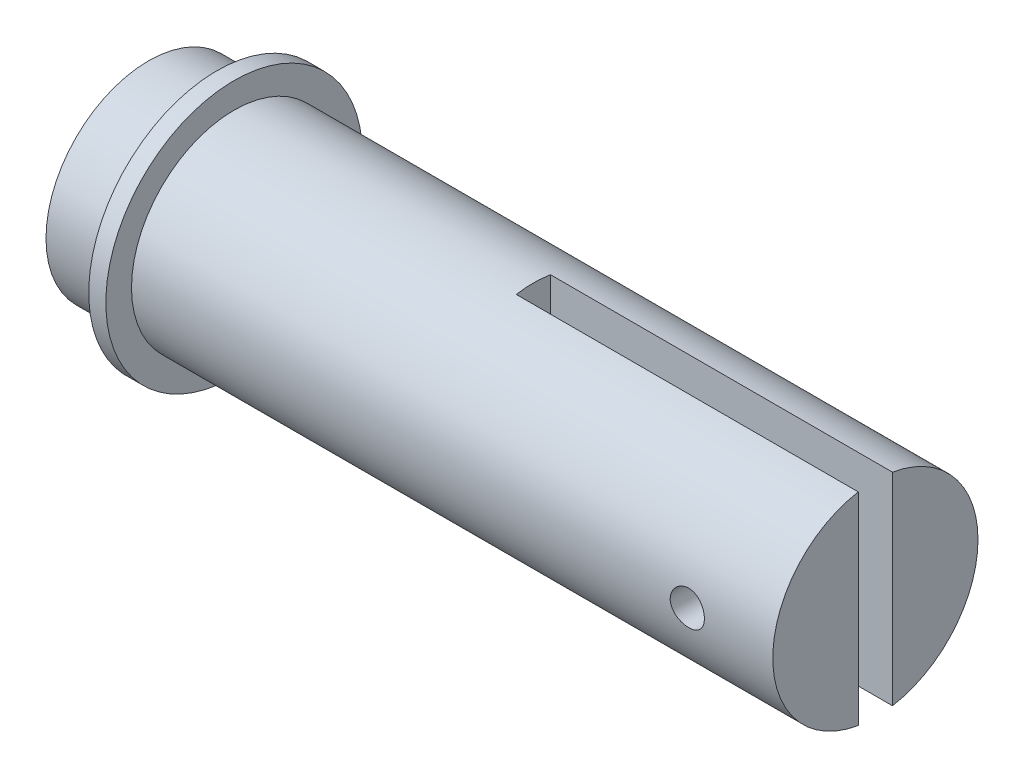
ISO-10303-21;
HEADER;
FILE_DESCRIPTION(('STEP AP214'),'2;1');
FILE_NAME('part.step','',(''),(''),'','','');
FILE_SCHEMA(('AUTOMOTIVE_DESIGN { 1 0 10303 214 1 1 1 1 }'));
ENDSEC;
DATA;
#1=APPLICATION_CONTEXT('core data for automotive mechanical design processes');
#2=APPLICATION_PROTOCOL_DEFINITION('international standard','automotive_design',2000,#1);
#3=PRODUCT_CONTEXT('',#1,'mechanical');
#4=PRODUCT('Part','Part','',(#3));
#5=PRODUCT_RELATED_PRODUCT_CATEGORY('part','',(#4));
#6=PRODUCT_DEFINITION_FORMATION('','',#4);
#7=PRODUCT_DEFINITION_CONTEXT('part definition',#1,'design');
#8=PRODUCT_DEFINITION('design','',#6,#7);
#9=PRODUCT_DEFINITION_SHAPE('','',#8);
#10=(LENGTH_UNIT() NAMED_UNIT(*) SI_UNIT(.MILLI.,.METRE.));
#11=(NAMED_UNIT(*) PLANE_ANGLE_UNIT() SI_UNIT($,.RADIAN.));
#12=(NAMED_UNIT(*) SI_UNIT($,.STERADIAN.) SOLID_ANGLE_UNIT());
#13=UNCERTAINTY_MEASURE_WITH_UNIT(LENGTH_MEASURE(1.E-05),#10,'distance_accuracy_value','');
#14=(GEOMETRIC_REPRESENTATION_CONTEXT(3) GLOBAL_UNCERTAINTY_ASSIGNED_CONTEXT((#13)) GLOBAL_UNIT_ASSIGNED_CONTEXT((#10,
#11,#12)) REPRESENTATION_CONTEXT('',''));
#15=CARTESIAN_POINT('',(0.,0.,0.));
#16=DIRECTION('',(0.,0.,1.));
#17=DIRECTION('',(1.,0.,0.));
#18=AXIS2_PLACEMENT_3D('',#15,#16,#17);
#19=CARTESIAN_POINT('',(-5.,0.,0.));
#20=DIRECTION('',(1.,0.,0.));
#21=DIRECTION('',(0.,0.,-1.));
#22=AXIS2_PLACEMENT_3D('',#19,#20,#21);
#23=CYLINDRICAL_SURFACE('',#22,12.);
#24=CARTESIAN_POINT('',(68.,0.,12.));
#25=CARTESIAN_POINT('',(68.0000044711582,0.111512723966572,11.9999980893506));
#26=CARTESIAN_POINT('',(68.0093578199751,0.223086305471056,11.9984294233043));
#27=CARTESIAN_POINT('',(68.0465085270123,0.443104177338433,11.9923227595311));
#28=CARTESIAN_POINT('',(68.0743228455293,0.551545494367395,11.9877820313911));
#29=CARTESIAN_POINT('',(68.1475323588742,0.762083797770111,11.9762405458916));
#30=CARTESIAN_POINT('',(68.1929131725125,0.864185894745516,11.9692418012735));
#31=CARTESIAN_POINT('',(68.2999298336419,1.05931347358235,11.9535538166566));
#32=CARTESIAN_POINT('',(68.3615638219864,1.15233999190287,11.9448647700355));
#33=CARTESIAN_POINT('',(68.4999640670564,1.32757809143334,11.9266665396665));
#34=CARTESIAN_POINT('',(68.5768552917089,1.40969032282797,11.9171509745189));
#35=CARTESIAN_POINT('',(68.7433183747783,1.55991079892794,11.8984210150139));
#36=CARTESIAN_POINT('',(68.8328910331653,1.62801815951277,11.8892066397013));
#37=CARTESIAN_POINT('',(69.0228567729577,1.7486937004841,11.8720605260782));
#38=CARTESIAN_POINT('',(69.1233130694438,1.8011636422888,11.8641370327331));
#39=CARTESIAN_POINT('',(69.3317676514405,1.88844669232897,11.8505583183574));
#40=CARTESIAN_POINT('',(69.4397654269421,1.92326099325249,11.8449029441145));
#41=CARTESIAN_POINT('',(69.6591842198852,1.97393150222784,11.836564294742));
#42=CARTESIAN_POINT('',(69.7705645892011,1.98995922330832,11.8338541478856));
#43=CARTESIAN_POINT('',(69.9944642215068,2.0031333802319,11.8316315114932));
#44=CARTESIAN_POINT('',(70.1069834033339,2.00028115231119,11.8321187956577));
#45=CARTESIAN_POINT('',(70.3287422890204,1.97591607871692,11.8362114309084));
#46=CARTESIAN_POINT('',(70.4380038428362,1.95459590551181,11.8397845865513));
#47=CARTESIAN_POINT('',(70.6513770542633,1.89420251232275,11.8495959616881));
#48=CARTESIAN_POINT('',(70.7554885351109,1.85512868345578,11.8558342725862));
#49=CARTESIAN_POINT('',(70.9561830587528,1.76014179687512,11.8703078346728));
#50=CARTESIAN_POINT('',(71.052727524865,1.70414873110376,11.8785525368586));
#51=CARTESIAN_POINT('',(71.2351235204307,1.57696961404594,11.8961033473201));
#52=CARTESIAN_POINT('',(71.3209741859639,1.50578233652342,11.9054095412343));
#53=CARTESIAN_POINT('',(71.4806608686459,1.34918576972724,11.9241762230383));
#54=CARTESIAN_POINT('',(71.5543348148321,1.2636111710985,11.9336371938532));
#55=CARTESIAN_POINT('',(71.6863022101323,1.08122819918531,11.9515408111738));
#56=CARTESIAN_POINT('',(71.7445955601466,0.984419753525136,11.959983451118));
#57=CARTESIAN_POINT('',(71.844161781709,0.78216473293337,11.9749111431433));
#58=CARTESIAN_POINT('',(71.885420335465,0.676710980451732,11.9813945472596));
#59=CARTESIAN_POINT('',(71.9495953721968,0.460238676482188,11.9916600241013));
#60=CARTESIAN_POINT('',(71.972513389579,0.349220591343575,11.9954423228038));
#61=CARTESIAN_POINT('',(71.9991370867689,0.126167921041297,11.9998490387415));
#62=CARTESIAN_POINT('',(72.0030652574445,0.0141605897208082,12.0005100241023));
#63=CARTESIAN_POINT('',(71.9921909244575,-0.208911818311909,11.9986997953694));
#64=CARTESIAN_POINT('',(71.977389141493,-0.31997693111363,11.9962287017929));
#65=CARTESIAN_POINT('',(71.9296601205316,-0.53732494043741,11.9884546155056));
#66=CARTESIAN_POINT('',(71.8968430332879,-0.643632694708303,11.9831688384105));
#67=CARTESIAN_POINT('',(71.8141323854404,-0.849237507888353,11.9703557156429));
#68=CARTESIAN_POINT('',(71.7642378658918,-0.948534172727772,11.9628282440962));
#69=CARTESIAN_POINT('',(71.6482791002426,-1.13826455157516,11.9462761304193));
#70=CARTESIAN_POINT('',(71.5820758750662,-1.22861220074972,11.9372388470962));
#71=CARTESIAN_POINT('',(71.435570147692,-1.39699486840215,11.9187077391352));
#72=CARTESIAN_POINT('',(71.3552666213787,-1.47502899175726,11.9092138813724));
#73=CARTESIAN_POINT('',(71.1818419615429,-1.61739422372639,11.8907214018868));
#74=CARTESIAN_POINT('',(71.0885966675885,-1.68157500889097,11.8817289290968));
#75=CARTESIAN_POINT('',(70.8925176246892,-1.79336184823598,11.8653722382231));
#76=CARTESIAN_POINT('',(70.789684179818,-1.84096842781585,11.8580079685282));
#77=CARTESIAN_POINT('',(70.5777682137503,-1.91803066517851,11.8457876295816));
#78=CARTESIAN_POINT('',(70.4687135239756,-1.94756114603835,11.8409212344885));
#79=CARTESIAN_POINT('',(70.2471038966226,-1.98786836302262,11.8342217346821));
#80=CARTESIAN_POINT('',(70.1345492642144,-1.99864672955693,11.8323883662618));
#81=CARTESIAN_POINT('',(69.9106358672301,-2.00109829283788,11.8319738646721));
#82=CARTESIAN_POINT('',(69.7992796971398,-1.99300810890014,11.8333524520452));
#83=CARTESIAN_POINT('',(69.5795366015594,-1.95846387116547,11.8391182516298));
#84=CARTESIAN_POINT('',(69.4711496664465,-1.93200987688998,11.8435054540897));
#85=CARTESIAN_POINT('',(69.2605132501659,-1.86157959167592,11.8547788502538));
#86=CARTESIAN_POINT('',(69.1582567919552,-1.81762367248035,11.8616621377574));
#87=CARTESIAN_POINT('',(68.9625314646441,-1.71346160313272,11.8771549513777));
#88=CARTESIAN_POINT('',(68.8690630317023,-1.65325464699884,11.8857645631072));
#89=CARTESIAN_POINT('',(68.6923715335138,-1.51745510749772,11.903867632365));
#90=CARTESIAN_POINT('',(68.6092831866398,-1.44168845087491,11.9133703646104));
#91=CARTESIAN_POINT('',(68.45691871642,-1.27728722510418,11.9321149788867));
#92=CARTESIAN_POINT('',(68.3876457850895,-1.1886496903301,11.9413568002124));
#93=CARTESIAN_POINT('',(68.2644413854401,-1.00029533571222,11.9586122371378));
#94=CARTESIAN_POINT('',(68.2106191685496,-0.900506230026246,11.9666169300248));
#95=CARTESIAN_POINT('',(68.1205844123121,-0.693210455503175,11.9804093408142));
#96=CARTESIAN_POINT('',(68.0843543351363,-0.585711595864,11.9861992654199));
#97=CARTESIAN_POINT('',(68.0383957806987,-0.398162648036314,11.9936463266636));
#98=CARTESIAN_POINT('',(68.0240204243072,-0.319247064238752,11.9960162181869));
#99=CARTESIAN_POINT('',(68.0048210097242,-0.160231448255843,11.999193727889));
#100=CARTESIAN_POINT('',(67.9999967870901,-0.0801314364867936,12.0000013729651));
#101=CARTESIAN_POINT('',(68.,0.,12.));
#102=B_SPLINE_CURVE_WITH_KNOTS('',3,(#24,#25,#26,#27,#28,#29,#30,#31,#32,#33,#34,#35,#36,#37,
#38,#39,#40,#41,#42,#43,#44,#45,#46,#47,#48,#49,#50,#51,#52,#53,#54,#55,#56,#57,#58,#59,#60,#61,
#62,#63,#64,#65,#66,#67,#68,#69,#70,#71,#72,#73,#74,#75,#76,#77,#78,#79,#80,#81,#82,#83,#84,#85,
#86,#87,#88,#89,#90,#91,#92,#93,#94,#95,#96,#97,#98,#99,#100,#101),.UNSPECIFIED.,.T.,.F.,(4,2,2,
2,2,2,2,2,2,2,2,2,2,2,2,2,2,2,2,2,2,2,2,2,2,2,2,2,2,2,2,2,2,2,2,2,2,2,4),(0.,0.334245267950807,
0.668798036556335,1.00307749362021,1.33731873013983,1.67441992849866,2.01154240135885,
2.35074016659072,2.68991501500944,3.02596861682738,3.36199843456709,3.69456417408328,
4.02714132020306,4.36131645306046,4.69551856544459,5.03386215929061,5.37220793308677,
5.71083751132721,6.04943875616918,6.38406306793116,6.71867450428686,7.05126245605131,
7.38386908660852,7.71941460501617,8.05498450443425,8.39403057606093,8.73306589900751,
9.07068817873414,9.40828110229293,9.74166327618159,10.075044369505,10.4080385458098,
10.7410492402347,11.0780110735471,11.4150506710318,11.7544178528576,12.0934460170406,
12.3336339853121,12.5738178182157),.UNSPECIFIED.);
#103=CARTESIAN_POINT('',(68.,0.,12.));
#104=VERTEX_POINT('',#103);
#105=EDGE_CURVE('E178',#104,#104,#102,.T.);
#106=ORIENTED_EDGE('',*,*,#105,.T.);
#107=EDGE_LOOP('',(#106));
#108=FACE_BOUND('',#107,.T.);
#109=CARTESIAN_POINT('',(5.,0.,0.));
#110=DIRECTION('',(1.,0.,0.));
#111=DIRECTION('',(0.,0.,-1.));
#112=AXIS2_PLACEMENT_3D('',#109,#110,#111);
#113=CIRCLE('',#112,12.);
#114=CARTESIAN_POINT('',(5.,0.,-12.));
#115=VERTEX_POINT('',#114);
#116=EDGE_CURVE('E13',#115,#115,#113,.F.);
#117=ORIENTED_EDGE('',*,*,#116,.F.);
#118=EDGE_LOOP('',(#117));
#119=FACE_BOUND('',#118,.T.);
#120=CARTESIAN_POINT('',(80.,0.,0.));
#121=DIRECTION('',(1.,0.,0.));
#122=DIRECTION('',(0.,0.,-1.));
#123=AXIS2_PLACEMENT_3D('',#120,#121,#122);
#124=CIRCLE('',#123,12.);
#125=CARTESIAN_POINT('',(80.,-11.8321595661992,-2.));
#126=VERTEX_POINT('',#125);
#127=CARTESIAN_POINT('',(80.,11.8321595661992,-2.));
#128=VERTEX_POINT('',#127);
#129=EDGE_CURVE('E134',#126,#128,#124,.T.);
#130=ORIENTED_EDGE('',*,*,#129,.F.);
#131=DIRECTION('',(1.,0.,0.));
#132=VECTOR('',#131,1.);
#133=CARTESIAN_POINT('',(40.,-11.8321595661992,-2.));
#134=LINE('',#133,#132);
#135=CARTESIAN_POINT('',(40.,-11.8321595661992,-2.));
#136=VERTEX_POINT('',#135);
#137=EDGE_CURVE('E91',#136,#126,#134,.T.);
#138=ORIENTED_EDGE('',*,*,#137,.F.);
#139=CARTESIAN_POINT('',(40.,0.,0.));
#140=DIRECTION('',(1.,0.,0.));
#141=DIRECTION('',(0.,0.,-1.));
#142=AXIS2_PLACEMENT_3D('',#139,#140,#141);
#143=CIRCLE('',#142,12.);
#144=CARTESIAN_POINT('',(40.,-11.8321595661992,2.));
#145=VERTEX_POINT('',#144);
#146=EDGE_CURVE('E104',#145,#136,#143,.T.);
#147=ORIENTED_EDGE('',*,*,#146,.F.);
#148=DIRECTION('',(1.,0.,0.));
#149=VECTOR('',#148,1.);
#150=CARTESIAN_POINT('',(40.,-11.8321595661992,2.));
#151=LINE('',#150,#149);
#152=CARTESIAN_POINT('',(80.,-11.8321595661992,2.));
#153=VERTEX_POINT('',#152);
#154=EDGE_CURVE('E102',#145,#153,#151,.T.);
#155=ORIENTED_EDGE('',*,*,#154,.T.);
#156=CARTESIAN_POINT('',(80.,11.8321595661992,2.));
#157=VERTEX_POINT('',#156);
#158=EDGE_CURVE('E116',#157,#153,#124,.T.);
#159=ORIENTED_EDGE('',*,*,#158,.F.);
#160=DIRECTION('',(1.,0.,0.));
#161=VECTOR('',#160,1.);
#162=CARTESIAN_POINT('',(40.,11.8321595661992,2.));
#163=LINE('',#162,#161);
#164=CARTESIAN_POINT('',(40.,11.8321595661992,2.));
#165=VERTEX_POINT('',#164);
#166=EDGE_CURVE('E99',#165,#157,#163,.T.);
#167=ORIENTED_EDGE('',*,*,#166,.F.);
#168=CARTESIAN_POINT('',(40.,11.8321595661992,-2.));
#169=VERTEX_POINT('',#168);
#170=EDGE_CURVE('E105',#169,#165,#143,.T.);
#171=ORIENTED_EDGE('',*,*,#170,.F.);
#172=DIRECTION('',(1.,0.,0.));
#173=VECTOR('',#172,1.);
#174=CARTESIAN_POINT('',(40.,11.8321595661992,-2.));
#175=LINE('',#174,#173);
#176=EDGE_CURVE('E117',#169,#128,#175,.T.);
#177=ORIENTED_EDGE('',*,*,#176,.T.);
#178=EDGE_LOOP('',(#130,#138,#147,#155,#159,#167,#171,#177));
#179=FACE_BOUND('',#178,.T.);
#180=CARTESIAN_POINT('',(68.,0.,-12.));
#181=CARTESIAN_POINT('',(68.0000044711582,-0.111512723966572,-11.9999980893506));
#182=CARTESIAN_POINT('',(68.0093578199751,-0.223086305471056,-11.9984294233043));
#183=CARTESIAN_POINT('',(68.0465085270123,-0.443104177338433,-11.9923227595311));
#184=CARTESIAN_POINT('',(68.0743228455293,-0.551545494367395,-11.9877820313911));
#185=CARTESIAN_POINT('',(68.1475323588742,-0.762083797770111,-11.9762405458916));
#186=CARTESIAN_POINT('',(68.1929131725125,-0.864185894745516,-11.9692418012735));
#187=CARTESIAN_POINT('',(68.2999298336419,-1.05931347358235,-11.9535538166566));
#188=CARTESIAN_POINT('',(68.3615638219864,-1.15233999190287,-11.9448647700355));
#189=CARTESIAN_POINT('',(68.4999640670564,-1.32757809143334,-11.9266665396665));
#190=CARTESIAN_POINT('',(68.5768552917089,-1.40969032282797,-11.9171509745189));
#191=CARTESIAN_POINT('',(68.7433183747783,-1.55991079892794,-11.8984210150139));
#192=CARTESIAN_POINT('',(68.8328910331653,-1.62801815951277,-11.8892066397013));
#193=CARTESIAN_POINT('',(69.0228567729577,-1.7486937004841,-11.8720605260782));
#194=CARTESIAN_POINT('',(69.1233130694438,-1.8011636422888,-11.8641370327331));
#195=CARTESIAN_POINT('',(69.3317676514405,-1.88844669232897,-11.8505583183574));
#196=CARTESIAN_POINT('',(69.4397654269421,-1.92326099325249,-11.8449029441145));
#197=CARTESIAN_POINT('',(69.6591842198852,-1.97393150222784,-11.836564294742));
#198=CARTESIAN_POINT('',(69.7705645892011,-1.98995922330832,-11.8338541478856));
#199=CARTESIAN_POINT('',(69.9944642215068,-2.0031333802319,-11.8316315114932));
#200=CARTESIAN_POINT('',(70.1069834033339,-2.00028115231119,-11.8321187956577));
#201=CARTESIAN_POINT('',(70.3287422890204,-1.97591607871692,-11.8362114309084));
#202=CARTESIAN_POINT('',(70.4380038428362,-1.95459590551181,-11.8397845865513));
#203=CARTESIAN_POINT('',(70.6513770542633,-1.89420251232275,-11.8495959616881));
#204=CARTESIAN_POINT('',(70.7554885351109,-1.85512868345578,-11.8558342725862));
#205=CARTESIAN_POINT('',(70.9561830587528,-1.76014179687512,-11.8703078346728));
#206=CARTESIAN_POINT('',(71.052727524865,-1.70414873110376,-11.8785525368586));
#207=CARTESIAN_POINT('',(71.2351235204307,-1.57696961404594,-11.8961033473201));
#208=CARTESIAN_POINT('',(71.3209741859639,-1.50578233652342,-11.9054095412343));
#209=CARTESIAN_POINT('',(71.4806608686459,-1.34918576972724,-11.9241762230383));
#210=CARTESIAN_POINT('',(71.5543348148321,-1.2636111710985,-11.9336371938532));
#211=CARTESIAN_POINT('',(71.6863022101323,-1.08122819918531,-11.9515408111738));
#212=CARTESIAN_POINT('',(71.7445955601466,-0.984419753525136,-11.959983451118));
#213=CARTESIAN_POINT('',(71.844161781709,-0.78216473293337,-11.9749111431433));
#214=CARTESIAN_POINT('',(71.885420335465,-0.676710980451732,-11.9813945472596));
#215=CARTESIAN_POINT('',(71.9495953721968,-0.460238676482188,-11.9916600241013));
#216=CARTESIAN_POINT('',(71.972513389579,-0.349220591343575,-11.9954423228038));
#217=CARTESIAN_POINT('',(71.9991370867689,-0.126167921041297,-11.9998490387415));
#218=CARTESIAN_POINT('',(72.0030652574445,-0.0141605897208082,-12.0005100241023));
#219=CARTESIAN_POINT('',(71.9921909244575,0.208911818311909,-11.9986997953694));
#220=CARTESIAN_POINT('',(71.977389141493,0.31997693111363,-11.9962287017929));
#221=CARTESIAN_POINT('',(71.9296601205316,0.53732494043741,-11.9884546155056));
#222=CARTESIAN_POINT('',(71.8968430332879,0.643632694708303,-11.9831688384105));
#223=CARTESIAN_POINT('',(71.8141323854404,0.849237507888353,-11.9703557156429));
#224=CARTESIAN_POINT('',(71.7642378658918,0.948534172727772,-11.9628282440962));
#225=CARTESIAN_POINT('',(71.6482791002426,1.13826455157516,-11.9462761304193));
#226=CARTESIAN_POINT('',(71.5820758750662,1.22861220074972,-11.9372388470962));
#227=CARTESIAN_POINT('',(71.435570147692,1.39699486840215,-11.9187077391352));
#228=CARTESIAN_POINT('',(71.3552666213787,1.47502899175726,-11.9092138813724));
#229=CARTESIAN_POINT('',(71.1818419615429,1.61739422372639,-11.8907214018868));
#230=CARTESIAN_POINT('',(71.0885966675885,1.68157500889097,-11.8817289290968));
#231=CARTESIAN_POINT('',(70.8925176246892,1.79336184823598,-11.8653722382231));
#232=CARTESIAN_POINT('',(70.789684179818,1.84096842781585,-11.8580079685282));
#233=CARTESIAN_POINT('',(70.5777682137503,1.91803066517851,-11.8457876295816));
#234=CARTESIAN_POINT('',(70.4687135239756,1.94756114603835,-11.8409212344885));
#235=CARTESIAN_POINT('',(70.2471038966226,1.98786836302262,-11.8342217346821));
#236=CARTESIAN_POINT('',(70.1345492642144,1.99864672955693,-11.8323883662618));
#237=CARTESIAN_POINT('',(69.9106358672301,2.00109829283788,-11.8319738646721));
#238=CARTESIAN_POINT('',(69.7992796971398,1.99300810890014,-11.8333524520452));
#239=CARTESIAN_POINT('',(69.5795366015594,1.95846387116547,-11.8391182516298));
#240=CARTESIAN_POINT('',(69.4711496664465,1.93200987688998,-11.8435054540897));
#241=CARTESIAN_POINT('',(69.2605132501659,1.86157959167592,-11.8547788502538));
#242=CARTESIAN_POINT('',(69.1582567919552,1.81762367248035,-11.8616621377574));
#243=CARTESIAN_POINT('',(68.9625314646441,1.71346160313272,-11.8771549513777));
#244=CARTESIAN_POINT('',(68.8690630317023,1.65325464699884,-11.8857645631072));
#245=CARTESIAN_POINT('',(68.6923715335138,1.51745510749772,-11.903867632365));
#246=CARTESIAN_POINT('',(68.6092831866398,1.44168845087491,-11.9133703646104));
#247=CARTESIAN_POINT('',(68.45691871642,1.27728722510418,-11.9321149788867));
#248=CARTESIAN_POINT('',(68.3876457850895,1.1886496903301,-11.9413568002124));
#249=CARTESIAN_POINT('',(68.2644413854401,1.00029533571222,-11.9586122371378));
#250=CARTESIAN_POINT('',(68.2106191685496,0.900506230026246,-11.9666169300248));
#251=CARTESIAN_POINT('',(68.1205844123121,0.693210455503175,-11.9804093408142));
#252=CARTESIAN_POINT('',(68.0843543351363,0.585711595864,-11.9861992654199));
#253=CARTESIAN_POINT('',(68.0383957806987,0.398162648036314,-11.9936463266636));
#254=CARTESIAN_POINT('',(68.0240204243072,0.319247064238752,-11.9960162181869));
#255=CARTESIAN_POINT('',(68.0048210097242,0.160231448255843,-11.999193727889));
#256=CARTESIAN_POINT('',(67.9999967870901,0.0801314364867936,-12.0000013729651));
#257=CARTESIAN_POINT('',(68.,0.,-12.));
#258=B_SPLINE_CURVE_WITH_KNOTS('',3,(#180,#181,#182,#183,#184,#185,#186,#187,#188,#189,#190,
#191,#192,#193,#194,#195,#196,#197,#198,#199,#200,#201,#202,#203,#204,#205,#206,#207,#208,#209,
#210,#211,#212,#213,#214,#215,#216,#217,#218,#219,#220,#221,#222,#223,#224,#225,#226,#227,#228,
#229,#230,#231,#232,#233,#234,#235,#236,#237,#238,#239,#240,#241,#242,#243,#244,#245,#246,#247,
#248,#249,#250,#251,#252,#253,#254,#255,#256,#257),.UNSPECIFIED.,.T.,.F.,(4,2,2,2,2,2,2,2,2,2,2,
2,2,2,2,2,2,2,2,2,2,2,2,2,2,2,2,2,2,2,2,2,2,2,2,2,2,2,4),(0.,0.334245267950807,
0.668798036556335,1.00307749362021,1.33731873013983,1.67441992849866,2.01154240135885,
2.35074016659072,2.68991501500944,3.02596861682738,3.36199843456709,3.69456417408328,
4.02714132020306,4.36131645306046,4.69551856544459,5.03386215929061,5.37220793308677,
5.71083751132721,6.04943875616918,6.38406306793116,6.71867450428686,7.05126245605131,
7.38386908660852,7.71941460501617,8.05498450443425,8.39403057606093,8.73306589900751,
9.07068817873414,9.40828110229293,9.74166327618159,10.075044369505,10.4080385458098,
10.7410492402347,11.0780110735471,11.4150506710318,11.7544178528576,12.0934460170406,
12.3336339853121,12.5738178182157),.UNSPECIFIED.);
#259=CARTESIAN_POINT('',(68.,0.,-12.));
#260=VERTEX_POINT('',#259);
#261=EDGE_CURVE('E220',#260,#260,#258,.T.);
#262=ORIENTED_EDGE('',*,*,#261,.T.);
#263=EDGE_LOOP('',(#262));
#264=FACE_BOUND('',#263,.T.);
#265=ADVANCED_FACE('F48',(#108,#119,#179,#264),#23,.T.);
#266=CARTESIAN_POINT('',(80.,0.,0.));
#267=DIRECTION('',(1.,0.,0.));
#268=DIRECTION('',(0.,0.,-1.));
#269=AXIS2_PLACEMENT_3D('',#266,#267,#268);
#270=PLANE('',#269);
#271=ORIENTED_EDGE('',*,*,#129,.T.);
#272=DIRECTION('',(0.,-1.,0.));
#273=VECTOR('',#272,1.);
#274=CARTESIAN_POINT('',(80.,0.,-2.));
#275=LINE('',#274,#273);
#276=EDGE_CURVE('E226',#128,#126,#275,.T.);
#277=ORIENTED_EDGE('',*,*,#276,.T.);
#278=EDGE_LOOP('',(#271,#277));
#279=FACE_BOUND('',#278,.T.);
#280=ADVANCED_FACE('F159',(#279),#270,.T.);
#281=CARTESIAN_POINT('',(0.,-11.8321595661992,2.));
#282=CARTESIAN_POINT('',(-0.111500598529449,-11.8321615789328,1.99999551873586));
#283=CARTESIAN_POINT('',(-0.223062084857178,-11.8337527390819,1.99064413522262));
#284=CARTESIAN_POINT('',(-0.443054834610535,-11.8399396576003,1.9535019424531));
#285=CARTESIAN_POINT('',(-0.551483115006452,-11.844538186771,1.92569412824689));
#286=CARTESIAN_POINT('',(-0.761993826673285,-11.8562048749385,1.8525036349364));
#287=CARTESIAN_POINT('',(-0.864081478929797,-11.8632709694721,1.80713564394559));
#288=CARTESIAN_POINT('',(-1.05918476377422,-11.8790741768183,1.70014919751157));
#289=CARTESIAN_POINT('',(-1.15220141566187,-11.8878111015538,1.63853257080106));
#290=CARTESIAN_POINT('',(-1.32745027979565,-11.906067769247,1.50015002157323));
#291=CARTESIAN_POINT('',(-1.40958010510897,-11.9155937386236,1.42325523914587));
#292=CARTESIAN_POINT('',(-1.55983464548945,-11.9342998453486,1.25677760375622));
#293=CARTESIAN_POINT('',(-1.62795853049233,-11.9434799621739,1.16719399931998));
#294=CARTESIAN_POINT('',(-1.74865165377542,-11.9605258958617,0.977218295958684));
#295=CARTESIAN_POINT('',(-1.80112560618544,-11.9683835394587,0.876764865165367));
#296=CARTESIAN_POINT('',(-1.88841685642444,-11.9818298956567,0.668316497379094));
#297=CARTESIAN_POINT('',(-1.9232353023079,-11.9874187557813,0.56032205126255));
#298=CARTESIAN_POINT('',(-1.97391402798712,-11.9956538777952,0.340914981075394));
#299=CARTESIAN_POINT('',(-1.98994633280375,-11.9983268248873,0.229543109343417));
#300=CARTESIAN_POINT('',(-2.00313260332208,-12.0005206347422,0.00566022842063782));
#301=CARTESIAN_POINT('',(-2.00028785219779,-12.0000417117545,-0.106850702823119));
#302=CARTESIAN_POINT('',(-1.97593491877743,-11.9960068674511,-0.328641748063101));
#303=CARTESIAN_POINT('',(-1.95461186927268,-11.9924814695392,-0.437942824560113));
#304=CARTESIAN_POINT('',(-1.89419914060281,-11.9827838301731,-0.651393583689433));
#305=CARTESIAN_POINT('',(-1.8551089203284,-11.9766115081057,-0.755543109321203));
#306=CARTESIAN_POINT('',(-1.76008748774774,-11.9622615880957,-0.956284918226118));
#307=CARTESIAN_POINT('',(-1.70407999033405,-11.954074938615,-1.05284041841524));
#308=CARTESIAN_POINT('',(-1.57686974189196,-11.936605904572,-1.23525242387731));
#309=CARTESIAN_POINT('',(-1.50566576103135,-11.9273234313531,-1.3211080623327));
#310=CARTESIAN_POINT('',(-1.34905695470455,-11.9085621458608,-1.48077701875733));
#311=CARTESIAN_POINT('',(-1.26349032407921,-11.8990823178483,-1.55443160180257));
#312=CARTESIAN_POINT('',(-1.08113032782734,-11.8811036782784,-1.68636367075845));
#313=CARTESIAN_POINT('',(-0.984336858653744,-11.8726048757706,-1.74464101482593));
#314=CARTESIAN_POINT('',(-0.782086686498017,-11.8575500364945,-1.84419554759063));
#315=CARTESIAN_POINT('',(-0.676620401526328,-11.8509961864208,-1.88545362182339));
#316=CARTESIAN_POINT('',(-0.460120742153965,-11.840609509519,-1.94962389665249));
#317=CARTESIAN_POINT('',(-0.349087858854061,-11.8367764431066,-1.97253771261436));
#318=CARTESIAN_POINT('',(-0.126027075070295,-11.8323116753769,-1.99914550790341));
#319=CARTESIAN_POINT('',(-0.0140268962383187,-11.8316422860694,-2.00306576632995));
#320=CARTESIAN_POINT('',(0.209029337352656,-11.8334802782589,-1.99217816214597));
#321=CARTESIAN_POINT('',(0.320085428411178,-11.8359875370548,-1.97737102289973));
#322=CARTESIAN_POINT('',(0.537382207352686,-11.8438614996401,-1.92964186794248));
#323=CARTESIAN_POINT('',(0.643648911902408,-11.8492100153468,-1.89683503251711));
#324=CARTESIAN_POINT('',(0.849176133023589,-11.862148584044,-1.81415855215382));
#325=CARTESIAN_POINT('',(0.948436230040721,-11.8697387711246,-1.76428788648075));
#326=CARTESIAN_POINT('',(1.13813967552489,-11.8863930271791,-1.64836533858338));
#327=CARTESIAN_POINT('',(1.22849325820485,-11.8954700448028,-1.58216845132749));
#328=CARTESIAN_POINT('',(1.396890826156,-11.9140373334389,-1.43567157256639));
#329=CARTESIAN_POINT('',(1.47493394488779,-11.9235276334827,-1.35537058910724));
#330=CARTESIAN_POINT('',(1.61732151418296,-11.9419713769461,-1.18194245626305));
#331=CARTESIAN_POINT('',(1.68151506102763,-11.9509182107574,-1.08869060270896));
#332=CARTESIAN_POINT('',(1.7933242616039,-11.9671608994635,-0.892594758359461));
#333=CARTESIAN_POINT('',(1.84094045157908,-11.9744568077598,-0.789751077976501));
#334=CARTESIAN_POINT('',(1.91800846716389,-11.9865468653567,-0.577839241201063));
#335=CARTESIAN_POINT('',(1.94753926058794,-11.9913518765409,-0.468800450082089));
#336=CARTESIAN_POINT('',(1.98785247917106,-11.9979646653543,-0.247224587899369));
#337=CARTESIAN_POINT('',(1.99863644698588,-11.9997726896015,-0.134687805457296));
#338=CARTESIAN_POINT('',(2.00110550584976,-12.0001843031025,0.0892330206189409));
#339=CARTESIAN_POINT('',(1.99302020315287,-11.9988264161935,0.200614528482131));
#340=CARTESIAN_POINT('',(1.95847686218446,-11.9931374270987,0.420409579451763));
#341=CARTESIAN_POINT('',(1.93201892679226,-11.9888063415615,0.528823139173983));
#342=CARTESIAN_POINT('',(1.86156946756508,-11.9776559106192,0.73951715673483));
#343=CARTESIAN_POINT('',(1.81759746543196,-11.970839336327,0.841804297723056));
#344=CARTESIAN_POINT('',(1.71339365101553,-11.9554620550242,1.03758436238573));
#345=CARTESIAN_POINT('',(1.65316106795004,-11.9469012653393,1.13107686889458));
#346=CARTESIAN_POINT('',(1.5173319260316,-11.9288610369313,1.30777035642112));
#347=CARTESIAN_POINT('',(1.441567236199,-11.919372196329,1.3908411444822));
#348=CARTESIAN_POINT('',(1.27717735367695,-11.900610426515,1.54317110076073));
#349=CARTESIAN_POINT('',(1.18854915286998,-11.8913375483961,1.61242702936952));
#350=CARTESIAN_POINT('',(1.00020374200831,-11.8739867482713,1.73561141672869));
#351=CARTESIAN_POINT('',(0.900412528187612,-11.8659177427663,1.78942799124616));
#352=CARTESIAN_POINT('',(0.693112611329484,-11.8519936807305,1.87945162912342));
#353=CARTESIAN_POINT('',(0.585611741858109,-11.846136413799,1.91567628417846));
#354=CARTESIAN_POINT('',(0.398076984410093,-11.8385979588519,1.96162084250194));
#355=CARTESIAN_POINT('',(0.319178553629914,-11.8361969873557,1.97598993413711));
#356=CARTESIAN_POINT('',(0.16019721213045,-11.8329770823046,1.99518103614505));
#357=CARTESIAN_POINT('',(0.0801143229406407,-11.8321581200295,2.00000321983422));
#358=CARTESIAN_POINT('',(0.,-11.8321595661992,2.));
#359=B_SPLINE_CURVE_WITH_KNOTS('',3,(#281,#282,#283,#284,#285,#286,#287,#288,#289,#290,#291,
#292,#293,#294,#295,#296,#297,#298,#299,#300,#301,#302,#303,#304,#305,#306,#307,#308,#309,#310,
#311,#312,#313,#314,#315,#316,#317,#318,#319,#320,#321,#322,#323,#324,#325,#326,#327,#328,#329,
#330,#331,#332,#333,#334,#335,#336,#337,#338,#339,#340,#341,#342,#343,#344,#345,#346,#347,#348,
#349,#350,#351,#352,#353,#354,#355,#356,#357,#358),.UNSPECIFIED.,.T.,.F.,(4,2,2,2,2,2,2,2,2,2,2,
2,2,2,2,2,2,2,2,2,2,2,2,2,2,2,2,2,2,2,2,2,2,2,2,2,2,2,4),(0.,0.334208831142192,
0.668726015970376,1.00296399830015,1.33716437924219,1.67431327324572,2.01148214267558,
2.35066384089148,2.6898234808889,3.02585253978052,3.36185875722154,3.69453696931735,
4.02722531399626,4.3614368331154,4.69567540981411,5.03396898769699,5.37226568596815,
5.71094129998883,6.04958708750462,6.38418833936328,6.71877666731181,7.05124851708393,
7.3837402583486,7.71929874210162,8.05488083544551,8.39395290428305,8.73301400381358,
9.07058387534117,9.40812596729881,9.74158221012733,10.0750365857506,10.4081203186597,
10.7412198431387,11.078135979706,11.4151310310545,11.7545098209466,12.0935485339556,
12.3336853643501,12.5738178352145),.UNSPECIFIED.);
#360=CARTESIAN_POINT('',(0.,-11.8321595661992,2.));
#361=VERTEX_POINT('',#360);
#362=EDGE_CURVE('E133',#361,#361,#359,.T.);
#363=ORIENTED_EDGE('',*,*,#362,.F.);
#364=EDGE_LOOP('',(#363));
#365=FACE_BOUND('',#364,.T.);
#366=CARTESIAN_POINT('',(-5.,0.,0.));
#367=DIRECTION('',(1.,0.,0.));
#368=DIRECTION('',(0.,0.,-1.));
#369=AXIS2_PLACEMENT_3D('',#366,#367,#368);
#370=CIRCLE('',#369,12.);
#371=CARTESIAN_POINT('',(-5.,0.,-12.));
#372=VERTEX_POINT('',#371);
#373=EDGE_CURVE('E62',#372,#372,#370,.T.);
#374=ORIENTED_EDGE('',*,*,#373,.T.);
#375=EDGE_LOOP('',(#374));
#376=FACE_BOUND('',#375,.T.);
#377=CARTESIAN_POINT('',(3.,0.,0.));
#378=DIRECTION('',(1.,0.,0.));
#379=DIRECTION('',(0.,0.,-1.));
#380=AXIS2_PLACEMENT_3D('',#377,#378,#379);
#381=CIRCLE('',#380,12.);
#382=CARTESIAN_POINT('',(3.,0.,-12.));
#383=VERTEX_POINT('',#382);
#384=EDGE_CURVE('E126',#383,#383,#381,.F.);
#385=ORIENTED_EDGE('',*,*,#384,.T.);
#386=EDGE_LOOP('',(#385));
#387=FACE_BOUND('',#386,.T.);
#388=ADVANCED_FACE('F161',(#365,#376,#387),#23,.T.);
#389=CARTESIAN_POINT('',(-5.,0.,0.));
#390=DIRECTION('',(1.,0.,0.));
#391=DIRECTION('',(0.,0.,-1.));
#392=AXIS2_PLACEMENT_3D('',#389,#390,#391);
#393=PLANE('',#392);
#394=CARTESIAN_POINT('',(-5.,-8.,0.));
#395=DIRECTION('',(1.,0.,0.));
#396=DIRECTION('',(0.,0.,-1.));
#397=AXIS2_PLACEMENT_3D('',#394,#395,#396);
#398=CIRCLE('',#397,1.);
#399=CARTESIAN_POINT('',(-5.,-8.,-1.));
#400=VERTEX_POINT('',#399);
#401=EDGE_CURVE('E237',#400,#400,#398,.T.);
#402=ORIENTED_EDGE('',*,*,#401,.T.);
#403=EDGE_LOOP('',(#402));
#404=FACE_BOUND('',#403,.T.);
#405=ORIENTED_EDGE('',*,*,#373,.F.);
#406=EDGE_LOOP('',(#405));
#407=FACE_BOUND('',#406,.T.);
#408=ADVANCED_FACE('F150',(#404,#407),#393,.F.);
#409=CARTESIAN_POINT('',(0.,-80.,0.));
#410=DIRECTION('',(0.,1.,0.));
#411=DIRECTION('',(0.,0.,1.));
#412=AXIS2_PLACEMENT_3D('',#409,#410,#411);
#413=CYLINDRICAL_SURFACE('',#412,2.);
#414=CARTESIAN_POINT('',(-1.73205080756888,-8.,-1.));
#415=CARTESIAN_POINT('',(-1.73205534728459,-8.05210780819525,-0.999996363074532));
#416=CARTESIAN_POINT('',(-1.73443801187756,-8.10428141152505,-0.995899970733217));
#417=CARTESIAN_POINT('',(-1.74362366452052,-8.20702726467715,-0.979723209898053));
#418=CARTESIAN_POINT('',(-1.75043594055559,-8.25759591504341,-0.967626064554179));
#419=CARTESIAN_POINT('',(-1.76749346605398,-8.35545166434394,-0.936099948699812));
#420=CARTESIAN_POINT('',(-1.77772043473252,-8.40275465247359,-0.916709952493731));
#421=CARTESIAN_POINT('',(-1.80042664816858,-8.49342420199672,-0.871267525376372));
#422=CARTESIAN_POINT('',(-1.81290601476065,-8.53679055026246,-0.845214734035774));
#423=CARTESIAN_POINT('',(-1.83996869057441,-8.62230572855751,-0.784666540530879));
#424=CARTESIAN_POINT('',(-1.85464063637954,-8.66405913567354,-0.749652036143771));
#425=CARTESIAN_POINT('',(-1.88371982785706,-8.74140838840671,-0.673253807614469));
#426=CARTESIAN_POINT('',(-1.8981269383125,-8.77700116258352,-0.631866925782293));
#427=CARTESIAN_POINT('',(-1.92621476952949,-8.84336715114766,-0.540489563414546));
#428=CARTESIAN_POINT('',(-1.93978106418172,-8.87365376785953,-0.490107189012575));
#429=CARTESIAN_POINT('',(-1.96350756099529,-8.92514085324576,-0.384157026599505));
#430=CARTESIAN_POINT('',(-1.97366991183742,-8.94634705613717,-0.328592538138156));
#431=CARTESIAN_POINT('',(-1.98880461244237,-8.9775046613011,-0.218044943925978));
#432=CARTESIAN_POINT('',(-1.99409480220892,-8.98814952635553,-0.163301790488818));
#433=CARTESIAN_POINT('',(-2.00007583846067,-9.00016611867504,-0.0525706286978488));
#434=CARTESIAN_POINT('',(-2.0007694678459,-9.00154345679571,0.00341660584373811));
#435=CARTESIAN_POINT('',(-1.9976298191645,-8.99525332602965,0.10983252442375));
#436=CARTESIAN_POINT('',(-1.9941849589216,-8.98836198447878,0.160321199176791));
#437=CARTESIAN_POINT('',(-1.98374245259747,-8.96711915609534,0.259313771918322));
#438=CARTESIAN_POINT('',(-1.97674454066394,-8.95276711102378,0.307817521093925));
#439=CARTESIAN_POINT('',(-1.95971583287654,-8.91691743391019,0.402309391569553));
#440=CARTESIAN_POINT('',(-1.94964441529199,-8.89532368682793,0.448253423515178));
#441=CARTESIAN_POINT('',(-1.92737645986687,-8.84573658379851,0.535976801513328));
#442=CARTESIAN_POINT('',(-1.91517916157484,-8.81774093669765,0.577754648838645));
#443=CARTESIAN_POINT('',(-1.88844394399229,-8.75310464846699,0.660173660898195));
#444=CARTESIAN_POINT('',(-1.87379375998175,-8.71589697167399,0.700334075029361));
#445=CARTESIAN_POINT('',(-1.84454340586812,-8.63541027506982,0.774104370297781));
#446=CARTESIAN_POINT('',(-1.82994328265629,-8.59212662772594,0.807709211574231));
#447=CARTESIAN_POINT('',(-1.80144156092485,-8.49735180757591,0.869505334642212));
#448=CARTESIAN_POINT('',(-1.78764319990708,-8.44551397694579,0.897217314978052));
#449=CARTESIAN_POINT('',(-1.76375450278576,-8.337062328641,0.943319113001232));
#450=CARTESIAN_POINT('',(-1.75366030046067,-8.28045356698244,0.961718658210889));
#451=CARTESIAN_POINT('',(-1.73944635817034,-8.16878548871721,0.98718021102504));
#452=CARTESIAN_POINT('',(-1.73491655848496,-8.11395888095645,0.995025122119976));
#453=CARTESIAN_POINT('',(-1.73117919361609,-8.00359865848346,1.00151694661143));
#454=CARTESIAN_POINT('',(-1.73196786889312,-7.94806557088022,1.00017035731503));
#455=CARTESIAN_POINT('',(-1.73834336540585,-7.84434608142127,0.989036043343966));
#456=CARTESIAN_POINT('',(-1.74339587506654,-7.79602054889207,0.980187816712467));
#457=CARTESIAN_POINT('',(-1.75694021551341,-7.70163221372904,0.955696284632441));
#458=CARTESIAN_POINT('',(-1.76543316005034,-7.65557014925339,0.940050778623615));
#459=CARTESIAN_POINT('',(-1.78536222079657,-7.5645886690973,0.901647588604886));
#460=CARTESIAN_POINT('',(-1.79691643243063,-7.51982098314645,0.878594063692724));
#461=CARTESIAN_POINT('',(-1.8215611949725,-7.43453072846101,0.826287064015804));
#462=CARTESIAN_POINT('',(-1.83465253355148,-7.39401035648672,0.797030404332216));
#463=CARTESIAN_POINT('',(-1.86287998456336,-7.31302123247645,0.728837167198854));
#464=CARTESIAN_POINT('',(-1.87806583154289,-7.27320284928234,0.689145272314967));
#465=CARTESIAN_POINT('',(-1.90734234977892,-7.20058776200641,0.60340449539829));
#466=CARTESIAN_POINT('',(-1.92143265007709,-7.16779342976946,0.557353474655348));
#467=CARTESIAN_POINT('',(-1.94741361690957,-7.1094262740499,0.458535362558758));
#468=CARTESIAN_POINT('',(-1.95923641672029,-7.08406688178909,0.405623097574114));
#469=CARTESIAN_POINT('',(-1.97883354959301,-7.04286209614261,0.295522364641083));
#470=CARTESIAN_POINT('',(-1.98661143676373,-7.0270083486337,0.238337701392177));
#471=CARTESIAN_POINT('',(-1.99667508181883,-7.00663143582534,0.126979682330418));
#472=CARTESIAN_POINT('',(-1.99939927908191,-7.00120212412389,0.0730114438504578));
#473=CARTESIAN_POINT('',(-2.00042130375131,-6.9991567345456,-0.0351259859512029));
#474=CARTESIAN_POINT('',(-1.9987206806689,-7.00253757147644,-0.0892951002950862));
#475=CARTESIAN_POINT('',(-1.99133968837923,-7.01741640679562,-0.192537992317146));
#476=CARTESIAN_POINT('',(-1.9859289466799,-7.02836484925767,-0.241712317811263));
#477=CARTESIAN_POINT('',(-1.97192093663423,-7.05732699930297,-0.337445952183617));
#478=CARTESIAN_POINT('',(-1.96332321132796,-7.07534172009345,-0.384004884955508));
#479=CARTESIAN_POINT('',(-1.9432593074812,-7.11872705216597,-0.475423406244884));
#480=CARTESIAN_POINT('',(-1.93168617198799,-7.14437932320784,-0.520125142700046));
#481=CARTESIAN_POINT('',(-1.90688133141826,-7.20195793085905,-0.604774641814024));
#482=CARTESIAN_POINT('',(-1.89364886558361,-7.23388714911567,-0.644720207414907));
#483=CARTESIAN_POINT('',(-1.86528610226628,-7.3067971390227,-0.722914004156891));
#484=CARTESIAN_POINT('',(-1.85009799011698,-7.34836248747719,-0.760597684539272));
#485=CARTESIAN_POINT('',(-1.82063076162852,-7.43745072112977,-0.828663287394675));
#486=CARTESIAN_POINT('',(-1.80635245761865,-7.48497882086768,-0.859038750010058));
#487=CARTESIAN_POINT('',(-1.77999605304916,-7.58663664658095,-0.912431079785654));
#488=CARTESIAN_POINT('',(-1.7680017425627,-7.64092753112874,-0.935185065960939));
#489=CARTESIAN_POINT('',(-1.74866156328352,-7.75333240433978,-0.970878709506412));
#490=CARTESIAN_POINT('',(-1.74130016147702,-7.81143288891269,-0.983851191175347));
#491=CARTESIAN_POINT('',(-1.7352927260179,-7.891805355652,-0.994367007864415));
#492=CARTESIAN_POINT('',(-1.73408129005152,-7.91336789439788,-0.996476104963851));
#493=CARTESIAN_POINT('',(-1.7324593588775,-7.95661648068224,-0.999293405089963));
#494=CARTESIAN_POINT('',(-1.73204891725109,-7.97830253638587,-1.00000151439987));
#495=CARTESIAN_POINT('',(-1.73205080756888,-8.,-1.));
#496=B_SPLINE_CURVE_WITH_KNOTS('',3,(#414,#415,#416,#417,#418,#419,#420,#421,#422,#423,#424,
#425,#426,#427,#428,#429,#430,#431,#432,#433,#434,#435,#436,#437,#438,#439,#440,#441,#442,#443,
#444,#445,#446,#447,#448,#449,#450,#451,#452,#453,#454,#455,#456,#457,#458,#459,#460,#461,#462,
#463,#464,#465,#466,#467,#468,#469,#470,#471,#472,#473,#474,#475,#476,#477,#478,#479,#480,#481,
#482,#483,#484,#485,#486,#487,#488,#489,#490,#491,#492,#493,#494,#495),.UNSPECIFIED.,.T.,.F.,(4,
2,2,2,2,2,2,2,2,2,2,2,2,2,2,2,2,2,2,2,2,2,2,2,2,2,2,2,2,2,2,2,2,2,2,2,2,2,2,2,4),(0.,
0.156232122594715,0.312792892824805,0.468528595918886,0.62427272544515,0.792862312498234,
0.96153571084371,1.14157892238763,1.32150826963891,1.48863484967935,1.6556602368604,
1.80816097484538,1.96067312517455,2.11529534731147,2.26997299350272,2.43927191456891,
2.60870048245919,2.78888841729448,2.96888774211705,3.13462290854212,3.30024093188373,
3.44774183424026,3.59529052436063,3.74967296406088,3.90413486220047,4.07806743580613,
4.25205864978202,4.43064181412966,4.60906779808772,4.77112270389487,4.93312086793972,
5.08444424871493,5.23578933512013,5.39360750719472,5.55149830100719,5.72510241850068,
5.89885942845154,6.07810749038605,6.2567513300276,6.32180135185309,6.38685572494541),.UNSPECIFIED.);
#497=CARTESIAN_POINT('',(-1.73205080756888,-8.,-1.));
#498=VERTEX_POINT('',#497);
#499=EDGE_CURVE('E52',#498,#498,#496,.T.);
#500=ORIENTED_EDGE('',*,*,#499,.T.);
#501=EDGE_LOOP('',(#500));
#502=FACE_BOUND('',#501,.T.);
#503=ORIENTED_EDGE('',*,*,#362,.T.);
#504=EDGE_LOOP('',(#503));
#505=FACE_BOUND('',#504,.T.);
#506=CARTESIAN_POINT('',(0.,0.,0.));
#507=DIRECTION('',(0.,1.,0.));
#508=DIRECTION('',(0.,0.,1.));
#509=AXIS2_PLACEMENT_3D('',#506,#507,#508);
#510=CIRCLE('',#509,2.);
#511=CARTESIAN_POINT('',(0.,0.,2.));
#512=VERTEX_POINT('',#511);
#513=EDGE_CURVE('E130',#512,#512,#510,.T.);
#514=ORIENTED_EDGE('',*,*,#513,.T.);
#515=EDGE_LOOP('',(#514));
#516=FACE_BOUND('',#515,.T.);
#517=ADVANCED_FACE('F144',(#502,#505,#516),#413,.F.);
#518=CARTESIAN_POINT('',(0.,0.,0.));
#519=DIRECTION('',(0.,1.,0.));
#520=DIRECTION('',(0.,0.,1.));
#521=AXIS2_PLACEMENT_3D('',#518,#519,#520);
#522=PLANE('',#521);
#523=ORIENTED_EDGE('',*,*,#513,.F.);
#524=EDGE_LOOP('',(#523));
#525=FACE_BOUND('',#524,.T.);
#526=ADVANCED_FACE('F149',(#525),#522,.F.);
#527=CARTESIAN_POINT('',(3.,0.,0.));
#528=DIRECTION('',(1.,0.,0.));
#529=DIRECTION('',(0.,0.,-1.));
#530=AXIS2_PLACEMENT_3D('',#527,#528,#529);
#531=CYLINDRICAL_SURFACE('',#530,15.);
#532=CARTESIAN_POINT('',(3.,0.,0.));
#533=DIRECTION('',(1.,0.,0.));
#534=DIRECTION('',(0.,0.,-1.));
#535=AXIS2_PLACEMENT_3D('',#532,#533,#534);
#536=CIRCLE('',#535,15.);
#537=CARTESIAN_POINT('',(3.,0.,-15.));
#538=VERTEX_POINT('',#537);
#539=EDGE_CURVE('E123',#538,#538,#536,.T.);
#540=ORIENTED_EDGE('',*,*,#539,.T.);
#541=EDGE_LOOP('',(#540));
#542=FACE_BOUND('',#541,.T.);
#543=CARTESIAN_POINT('',(5.,0.,0.));
#544=DIRECTION('',(1.,0.,0.));
#545=DIRECTION('',(0.,0.,-1.));
#546=AXIS2_PLACEMENT_3D('',#543,#544,#545);
#547=CIRCLE('',#546,15.);
#548=CARTESIAN_POINT('',(5.,0.,-15.));
#549=VERTEX_POINT('',#548);
#550=EDGE_CURVE('E127',#549,#549,#547,.T.);
#551=ORIENTED_EDGE('',*,*,#550,.F.);
#552=EDGE_LOOP('',(#551));
#553=FACE_BOUND('',#552,.T.);
#554=ADVANCED_FACE('F187',(#542,#553),#531,.T.);
#555=CARTESIAN_POINT('',(3.,0.,0.));
#556=DIRECTION('',(1.,0.,0.));
#557=DIRECTION('',(0.,0.,-1.));
#558=AXIS2_PLACEMENT_3D('',#555,#556,#557);
#559=PLANE('',#558);
#560=ORIENTED_EDGE('',*,*,#384,.F.);
#561=EDGE_LOOP('',(#560));
#562=FACE_BOUND('',#561,.T.);
#563=ORIENTED_EDGE('',*,*,#539,.F.);
#564=EDGE_LOOP('',(#563));
#565=FACE_BOUND('',#564,.T.);
#566=ADVANCED_FACE('F183',(#562,#565),#559,.F.);
#567=CARTESIAN_POINT('',(5.,0.,0.));
#568=DIRECTION('',(1.,0.,0.));
#569=DIRECTION('',(0.,0.,-1.));
#570=AXIS2_PLACEMENT_3D('',#567,#568,#569);
#571=PLANE('',#570);
#572=ORIENTED_EDGE('',*,*,#116,.T.);
#573=EDGE_LOOP('',(#572));
#574=FACE_BOUND('',#573,.T.);
#575=ORIENTED_EDGE('',*,*,#550,.T.);
#576=EDGE_LOOP('',(#575));
#577=FACE_BOUND('',#576,.T.);
#578=ADVANCED_FACE('F157',(#574,#577),#571,.T.);
#579=DIRECTION('',(0.,-1.,0.));
#580=VECTOR('',#579,1.);
#581=CARTESIAN_POINT('',(80.,0.,2.));
#582=LINE('',#581,#580);
#583=EDGE_CURVE('E227',#157,#153,#582,.T.);
#584=ORIENTED_EDGE('',*,*,#583,.F.);
#585=ORIENTED_EDGE('',*,*,#158,.T.);
#586=EDGE_LOOP('',(#584,#585));
#587=FACE_BOUND('',#586,.T.);
#588=ADVANCED_FACE('F153',(#587),#270,.T.);
#589=CARTESIAN_POINT('',(40.,0.,-2.));
#590=DIRECTION('',(0.,0.,1.));
#591=DIRECTION('',(1.,0.,0.));
#592=AXIS2_PLACEMENT_3D('',#589,#590,#591);
#593=PLANE('',#592);
#594=CARTESIAN_POINT('',(70.,0.,-2.));
#595=DIRECTION('',(0.,0.,1.));
#596=DIRECTION('',(1.,0.,0.));
#597=AXIS2_PLACEMENT_3D('',#594,#595,#596);
#598=CIRCLE('',#597,2.);
#599=CARTESIAN_POINT('',(72.,0.,-2.));
#600=VERTEX_POINT('',#599);
#601=EDGE_CURVE('E231',#600,#600,#598,.F.);
#602=ORIENTED_EDGE('',*,*,#601,.T.);
#603=EDGE_LOOP('',(#602));
#604=FACE_BOUND('',#603,.T.);
#605=ORIENTED_EDGE('',*,*,#276,.F.);
#606=ORIENTED_EDGE('',*,*,#176,.F.);
#607=DIRECTION('',(0.,-1.,0.));
#608=VECTOR('',#607,1.);
#609=CARTESIAN_POINT('',(40.,0.,-2.));
#610=LINE('',#609,#608);
#611=EDGE_CURVE('E70',#169,#136,#610,.T.);
#612=ORIENTED_EDGE('',*,*,#611,.T.);
#613=ORIENTED_EDGE('',*,*,#137,.T.);
#614=EDGE_LOOP('',(#605,#606,#612,#613));
#615=FACE_BOUND('',#614,.T.);
#616=ADVANCED_FACE('F156',(#604,#615),#593,.T.);
#617=CARTESIAN_POINT('',(40.,0.,2.));
#618=DIRECTION('',(0.,0.,1.));
#619=DIRECTION('',(1.,0.,0.));
#620=AXIS2_PLACEMENT_3D('',#617,#618,#619);
#621=PLANE('',#620);
#622=CARTESIAN_POINT('',(70.,0.,2.));
#623=DIRECTION('',(0.,0.,1.));
#624=DIRECTION('',(1.,0.,0.));
#625=AXIS2_PLACEMENT_3D('',#622,#623,#624);
#626=CIRCLE('',#625,2.);
#627=CARTESIAN_POINT('',(72.,0.,2.));
#628=VERTEX_POINT('',#627);
#629=EDGE_CURVE('E233',#628,#628,#626,.F.);
#630=ORIENTED_EDGE('',*,*,#629,.F.);
#631=EDGE_LOOP('',(#630));
#632=FACE_BOUND('',#631,.T.);
#633=ORIENTED_EDGE('',*,*,#583,.T.);
#634=ORIENTED_EDGE('',*,*,#154,.F.);
#635=DIRECTION('',(0.,-1.,0.));
#636=VECTOR('',#635,1.);
#637=CARTESIAN_POINT('',(40.,0.,2.));
#638=LINE('',#637,#636);
#639=EDGE_CURVE('E96',#165,#145,#638,.T.);
#640=ORIENTED_EDGE('',*,*,#639,.F.);
#641=ORIENTED_EDGE('',*,*,#166,.T.);
#642=EDGE_LOOP('',(#633,#634,#640,#641));
#643=FACE_BOUND('',#642,.T.);
#644=ADVANCED_FACE('F97',(#632,#643),#621,.F.);
#645=CARTESIAN_POINT('',(40.,0.,0.));
#646=DIRECTION('',(1.,0.,0.));
#647=DIRECTION('',(0.,0.,-1.));
#648=AXIS2_PLACEMENT_3D('',#645,#646,#647);
#649=PLANE('',#648);
#650=ORIENTED_EDGE('',*,*,#611,.F.);
#651=ORIENTED_EDGE('',*,*,#170,.T.);
#652=ORIENTED_EDGE('',*,*,#639,.T.);
#653=ORIENTED_EDGE('',*,*,#146,.T.);
#654=EDGE_LOOP('',(#650,#651,#652,#653));
#655=FACE_BOUND('',#654,.T.);
#656=ADVANCED_FACE('F108',(#655),#649,.T.);
#657=CARTESIAN_POINT('',(70.,0.,38.));
#658=DIRECTION('',(0.,0.,-1.));
#659=DIRECTION('',(-1.,0.,0.));
#660=AXIS2_PLACEMENT_3D('',#657,#658,#659);
#661=CYLINDRICAL_SURFACE('',#660,2.);
#662=ORIENTED_EDGE('',*,*,#105,.F.);
#663=EDGE_LOOP('',(#662));
#664=FACE_BOUND('',#663,.T.);
#665=ORIENTED_EDGE('',*,*,#629,.T.);
#666=EDGE_LOOP('',(#665));
#667=FACE_BOUND('',#666,.T.);
#668=ADVANCED_FACE('F206',(#664,#667),#661,.F.);
#669=ORIENTED_EDGE('',*,*,#261,.F.);
#670=EDGE_LOOP('',(#669));
#671=FACE_BOUND('',#670,.T.);
#672=ORIENTED_EDGE('',*,*,#601,.F.);
#673=EDGE_LOOP('',(#672));
#674=FACE_BOUND('',#673,.T.);
#675=ADVANCED_FACE('F207',(#671,#674),#661,.F.);
#676=CARTESIAN_POINT('',(-5.,-8.,0.));
#677=DIRECTION('',(1.,0.,0.));
#678=DIRECTION('',(0.,0.,-1.));
#679=AXIS2_PLACEMENT_3D('',#676,#677,#678);
#680=CYLINDRICAL_SURFACE('',#679,1.);
#681=ORIENTED_EDGE('',*,*,#401,.F.);
#682=EDGE_LOOP('',(#681));
#683=FACE_BOUND('',#682,.T.);
#684=ORIENTED_EDGE('',*,*,#499,.F.);
#685=EDGE_LOOP('',(#684));
#686=FACE_BOUND('',#685,.T.);
#687=ADVANCED_FACE('F210',(#683,#686),#680,.F.);
#688=CLOSED_SHELL('',(#265,#280,#388,#408,#517,#526,#554,#566,#578,#588,#616,#644,#656,#668,
#675,#687));
#689=MANIFOLD_SOLID_BREP('B2',#688);
#690=ADVANCED_BREP_SHAPE_REPRESENTATION('',(#18,#689),#14);
#691=SHAPE_DEFINITION_REPRESENTATION(#9,#690);
ENDSEC;
END-ISO-10303-21;
